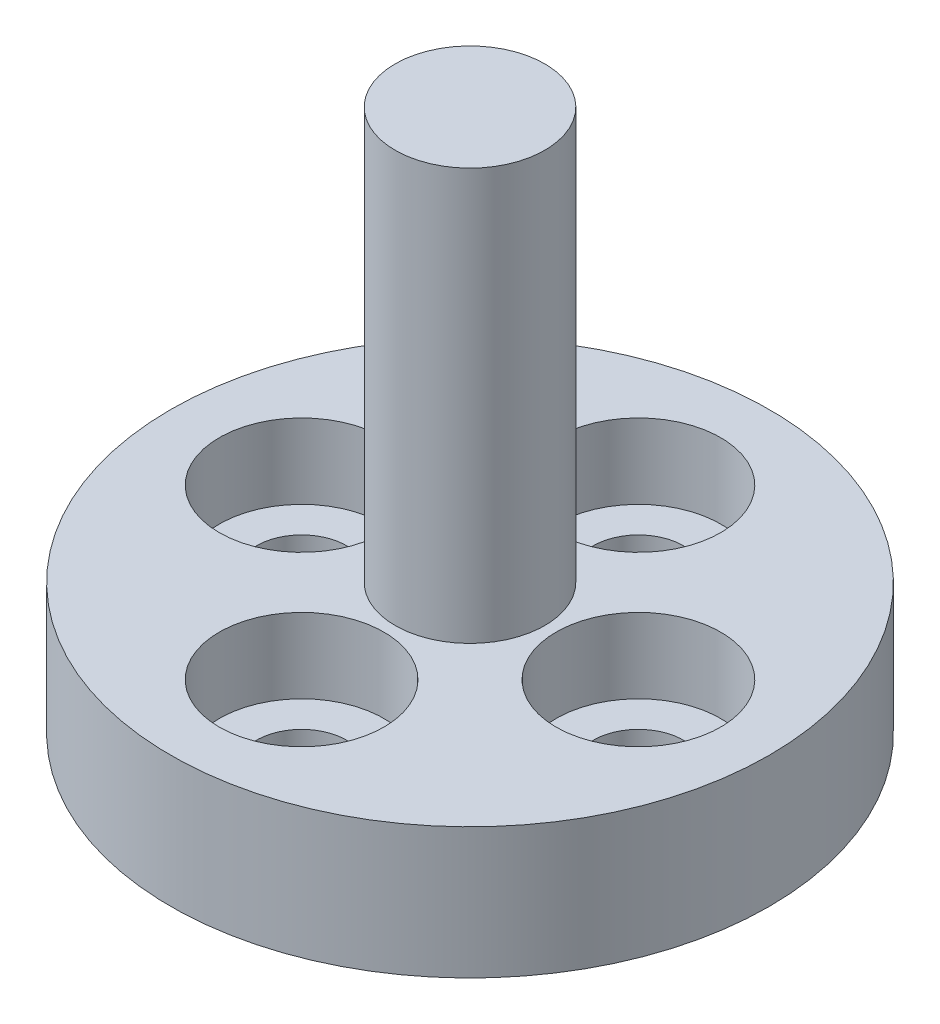
ISO-10303-21;
HEADER;
FILE_DESCRIPTION(('STEP AP214'),'2;1');
FILE_NAME('part.step','',(''),(''),'','','');
FILE_SCHEMA(('AUTOMOTIVE_DESIGN { 1 0 10303 214 1 1 1 1 }'));
ENDSEC;
DATA;
#1=APPLICATION_CONTEXT('core data for automotive mechanical design processes');
#2=APPLICATION_PROTOCOL_DEFINITION('international standard','automotive_design',2000,#1);
#3=PRODUCT_CONTEXT('',#1,'mechanical');
#4=PRODUCT('Part','Part','',(#3));
#5=PRODUCT_RELATED_PRODUCT_CATEGORY('part','',(#4));
#6=PRODUCT_DEFINITION_FORMATION('','',#4);
#7=PRODUCT_DEFINITION_CONTEXT('part definition',#1,'design');
#8=PRODUCT_DEFINITION('design','',#6,#7);
#9=PRODUCT_DEFINITION_SHAPE('','',#8);
#10=(LENGTH_UNIT() NAMED_UNIT(*) SI_UNIT(.MILLI.,.METRE.));
#11=(NAMED_UNIT(*) PLANE_ANGLE_UNIT() SI_UNIT($,.RADIAN.));
#12=(NAMED_UNIT(*) SI_UNIT($,.STERADIAN.) SOLID_ANGLE_UNIT());
#13=UNCERTAINTY_MEASURE_WITH_UNIT(LENGTH_MEASURE(1.E-05),#10,'distance_accuracy_value','');
#14=(GEOMETRIC_REPRESENTATION_CONTEXT(3) GLOBAL_UNCERTAINTY_ASSIGNED_CONTEXT((#13)) GLOBAL_UNIT_ASSIGNED_CONTEXT((#10,
#11,#12)) REPRESENTATION_CONTEXT('',''));
#15=CARTESIAN_POINT('',(0.,0.,0.));
#16=DIRECTION('',(0.,0.,1.));
#17=DIRECTION('',(1.,0.,0.));
#18=AXIS2_PLACEMENT_3D('',#15,#16,#17);
#19=CARTESIAN_POINT('',(0.,0.,0.));
#20=DIRECTION('',(0.,1.,0.));
#21=DIRECTION('',(-1.,0.,0.));
#22=AXIS2_PLACEMENT_3D('',#19,#20,#21);
#23=PLANE('',#22);
#24=CARTESIAN_POINT('',(-4.5,0.,0.));
#25=DIRECTION('',(0.,1.,0.));
#26=DIRECTION('',(0.,0.,1.));
#27=AXIS2_PLACEMENT_3D('',#24,#25,#26);
#28=CIRCLE('',#27,1.2);
#29=CARTESIAN_POINT('',(-4.5,0.,1.2));
#30=VERTEX_POINT('',#29);
#31=EDGE_CURVE('E91',#30,#30,#28,.T.);
#32=ORIENTED_EDGE('',*,*,#31,.T.);
#33=EDGE_LOOP('',(#32));
#34=FACE_BOUND('',#33,.T.);
#35=CARTESIAN_POINT('',(0.,0.,-4.5));
#36=DIRECTION('',(0.,1.,0.));
#37=DIRECTION('',(0.,0.,1.));
#38=AXIS2_PLACEMENT_3D('',#35,#36,#37);
#39=CIRCLE('',#38,1.2);
#40=CARTESIAN_POINT('',(0.,0.,-3.3));
#41=VERTEX_POINT('',#40);
#42=EDGE_CURVE('E79',#41,#41,#39,.T.);
#43=ORIENTED_EDGE('',*,*,#42,.T.);
#44=EDGE_LOOP('',(#43));
#45=FACE_BOUND('',#44,.T.);
#46=CARTESIAN_POINT('',(4.5,0.,0.));
#47=DIRECTION('',(0.,1.,0.));
#48=DIRECTION('',(0.,0.,1.));
#49=AXIS2_PLACEMENT_3D('',#46,#47,#48);
#50=CIRCLE('',#49,1.2);
#51=CARTESIAN_POINT('',(4.5,0.,1.2));
#52=VERTEX_POINT('',#51);
#53=EDGE_CURVE('E67',#52,#52,#50,.T.);
#54=ORIENTED_EDGE('',*,*,#53,.T.);
#55=EDGE_LOOP('',(#54));
#56=FACE_BOUND('',#55,.T.);
#57=CARTESIAN_POINT('',(0.,0.,4.5));
#58=DIRECTION('',(0.,1.,0.));
#59=DIRECTION('',(0.,0.,1.));
#60=AXIS2_PLACEMENT_3D('',#57,#58,#59);
#61=CIRCLE('',#60,1.2);
#62=CARTESIAN_POINT('',(0.,0.,5.7));
#63=VERTEX_POINT('',#62);
#64=EDGE_CURVE('E55',#63,#63,#61,.T.);
#65=ORIENTED_EDGE('',*,*,#64,.T.);
#66=EDGE_LOOP('',(#65));
#67=FACE_BOUND('',#66,.T.);
#68=CARTESIAN_POINT('',(0.,0.,0.));
#69=DIRECTION('',(0.,1.,0.));
#70=DIRECTION('',(-1.,0.,0.));
#71=AXIS2_PLACEMENT_3D('',#68,#69,#70);
#72=CIRCLE('',#71,8.);
#73=CARTESIAN_POINT('',(-8.,0.,0.));
#74=VERTEX_POINT('',#73);
#75=EDGE_CURVE('E10',#74,#74,#72,.T.);
#76=ORIENTED_EDGE('',*,*,#75,.F.);
#77=EDGE_LOOP('',(#76));
#78=FACE_BOUND('',#77,.T.);
#79=ADVANCED_FACE('F36',(#34,#45,#56,#67,#78),#23,.F.);
#80=CARTESIAN_POINT('',(0.,14.5,0.));
#81=DIRECTION('',(0.,1.,0.));
#82=DIRECTION('',(-1.,0.,0.));
#83=AXIS2_PLACEMENT_3D('',#80,#81,#82);
#84=CYLINDRICAL_SURFACE('',#83,8.);
#85=CARTESIAN_POINT('',(0.,3.5,0.));
#86=DIRECTION('',(0.,1.,0.));
#87=DIRECTION('',(-1.,0.,0.));
#88=AXIS2_PLACEMENT_3D('',#85,#86,#87);
#89=CIRCLE('',#88,8.);
#90=CARTESIAN_POINT('',(-8.,3.5,0.));
#91=VERTEX_POINT('',#90);
#92=EDGE_CURVE('E42',#91,#91,#89,.T.);
#93=ORIENTED_EDGE('',*,*,#92,.F.);
#94=EDGE_LOOP('',(#93));
#95=FACE_BOUND('',#94,.T.);
#96=ORIENTED_EDGE('',*,*,#75,.T.);
#97=EDGE_LOOP('',(#96));
#98=FACE_BOUND('',#97,.T.);
#99=ADVANCED_FACE('F110',(#95,#98),#84,.T.);
#100=CARTESIAN_POINT('',(8.,3.5,0.));
#101=DIRECTION('',(0.,-1.,0.));
#102=DIRECTION('',(1.,0.,0.));
#103=AXIS2_PLACEMENT_3D('',#100,#101,#102);
#104=PLANE('',#103);
#105=CARTESIAN_POINT('',(-4.5,3.5,0.));
#106=DIRECTION('',(0.,1.,0.));
#107=DIRECTION('',(0.,0.,1.));
#108=AXIS2_PLACEMENT_3D('',#105,#106,#107);
#109=CIRCLE('',#108,2.2);
#110=CARTESIAN_POINT('',(-4.5,3.5,2.2));
#111=VERTEX_POINT('',#110);
#112=EDGE_CURVE('E100',#111,#111,#109,.T.);
#113=ORIENTED_EDGE('',*,*,#112,.F.);
#114=EDGE_LOOP('',(#113));
#115=FACE_BOUND('',#114,.T.);
#116=CARTESIAN_POINT('',(0.,3.5,-4.5));
#117=DIRECTION('',(0.,1.,0.));
#118=DIRECTION('',(0.,0.,1.));
#119=AXIS2_PLACEMENT_3D('',#116,#117,#118);
#120=CIRCLE('',#119,2.2);
#121=CARTESIAN_POINT('',(0.,3.5,-2.3));
#122=VERTEX_POINT('',#121);
#123=EDGE_CURVE('E88',#122,#122,#120,.T.);
#124=ORIENTED_EDGE('',*,*,#123,.F.);
#125=EDGE_LOOP('',(#124));
#126=FACE_BOUND('',#125,.T.);
#127=CARTESIAN_POINT('',(4.5,3.5,0.));
#128=DIRECTION('',(0.,1.,0.));
#129=DIRECTION('',(0.,0.,1.));
#130=AXIS2_PLACEMENT_3D('',#127,#128,#129);
#131=CIRCLE('',#130,2.2);
#132=CARTESIAN_POINT('',(4.5,3.5,2.2));
#133=VERTEX_POINT('',#132);
#134=EDGE_CURVE('E76',#133,#133,#131,.T.);
#135=ORIENTED_EDGE('',*,*,#134,.F.);
#136=EDGE_LOOP('',(#135));
#137=FACE_BOUND('',#136,.T.);
#138=CARTESIAN_POINT('',(0.,3.5,4.5));
#139=DIRECTION('',(0.,1.,0.));
#140=DIRECTION('',(0.,0.,1.));
#141=AXIS2_PLACEMENT_3D('',#138,#139,#140);
#142=CIRCLE('',#141,2.2);
#143=CARTESIAN_POINT('',(0.,3.5,6.7));
#144=VERTEX_POINT('',#143);
#145=EDGE_CURVE('E64',#144,#144,#142,.T.);
#146=ORIENTED_EDGE('',*,*,#145,.F.);
#147=EDGE_LOOP('',(#146));
#148=FACE_BOUND('',#147,.T.);
#149=CARTESIAN_POINT('',(0.,3.5,0.));
#150=DIRECTION('',(0.,1.,0.));
#151=DIRECTION('',(-1.,0.,0.));
#152=AXIS2_PLACEMENT_3D('',#149,#150,#151);
#153=CIRCLE('',#152,2.);
#154=CARTESIAN_POINT('',(-2.,3.5,0.));
#155=VERTEX_POINT('',#154);
#156=EDGE_CURVE('E46',#155,#155,#153,.T.);
#157=ORIENTED_EDGE('',*,*,#156,.F.);
#158=EDGE_LOOP('',(#157));
#159=FACE_BOUND('',#158,.T.);
#160=ORIENTED_EDGE('',*,*,#92,.T.);
#161=EDGE_LOOP('',(#160));
#162=FACE_BOUND('',#161,.T.);
#163=ADVANCED_FACE('F106',(#115,#126,#137,#148,#159,#162),#104,.F.);
#164=CARTESIAN_POINT('',(0.,14.5,0.));
#165=DIRECTION('',(0.,1.,0.));
#166=DIRECTION('',(-1.,0.,0.));
#167=AXIS2_PLACEMENT_3D('',#164,#165,#166);
#168=CYLINDRICAL_SURFACE('',#167,2.);
#169=CARTESIAN_POINT('',(0.,14.5,0.));
#170=DIRECTION('',(0.,1.,0.));
#171=DIRECTION('',(-1.,0.,0.));
#172=AXIS2_PLACEMENT_3D('',#169,#170,#171);
#173=CIRCLE('',#172,2.);
#174=CARTESIAN_POINT('',(-2.,14.5,0.));
#175=VERTEX_POINT('',#174);
#176=EDGE_CURVE('E50',#175,#175,#173,.T.);
#177=ORIENTED_EDGE('',*,*,#176,.F.);
#178=EDGE_LOOP('',(#177));
#179=FACE_BOUND('',#178,.T.);
#180=ORIENTED_EDGE('',*,*,#156,.T.);
#181=EDGE_LOOP('',(#180));
#182=FACE_BOUND('',#181,.T.);
#183=ADVANCED_FACE('F109',(#179,#182),#168,.T.);
#184=CARTESIAN_POINT('',(2.,14.5,0.));
#185=DIRECTION('',(0.,-1.,0.));
#186=DIRECTION('',(1.,0.,0.));
#187=AXIS2_PLACEMENT_3D('',#184,#185,#186);
#188=PLANE('',#187);
#189=ORIENTED_EDGE('',*,*,#176,.T.);
#190=EDGE_LOOP('',(#189));
#191=FACE_BOUND('',#190,.T.);
#192=ADVANCED_FACE('F121',(#191),#188,.F.);
#193=CARTESIAN_POINT('',(0.,3.5,4.5));
#194=DIRECTION('',(0.,1.,0.));
#195=DIRECTION('',(0.,0.,1.));
#196=AXIS2_PLACEMENT_3D('',#193,#194,#195);
#197=CYLINDRICAL_SURFACE('',#196,1.2);
#198=ORIENTED_EDGE('',*,*,#64,.F.);
#199=EDGE_LOOP('',(#198));
#200=FACE_BOUND('',#199,.T.);
#201=CARTESIAN_POINT('',(0.,1.5,4.5));
#202=DIRECTION('',(0.,1.,0.));
#203=DIRECTION('',(0.,0.,1.));
#204=AXIS2_PLACEMENT_3D('',#201,#202,#203);
#205=CIRCLE('',#204,1.2);
#206=CARTESIAN_POINT('',(0.,1.5,5.7));
#207=VERTEX_POINT('',#206);
#208=EDGE_CURVE('E58',#207,#207,#205,.T.);
#209=ORIENTED_EDGE('',*,*,#208,.T.);
#210=EDGE_LOOP('',(#209));
#211=FACE_BOUND('',#210,.T.);
#212=ADVANCED_FACE('F127',(#200,#211),#197,.F.);
#213=CARTESIAN_POINT('',(1.2,1.5,4.5));
#214=DIRECTION('',(0.,-1.,0.));
#215=DIRECTION('',(0.,0.,-1.));
#216=AXIS2_PLACEMENT_3D('',#213,#214,#215);
#217=PLANE('',#216);
#218=ORIENTED_EDGE('',*,*,#208,.F.);
#219=EDGE_LOOP('',(#218));
#220=FACE_BOUND('',#219,.T.);
#221=CARTESIAN_POINT('',(0.,1.5,4.5));
#222=DIRECTION('',(0.,1.,0.));
#223=DIRECTION('',(0.,0.,1.));
#224=AXIS2_PLACEMENT_3D('',#221,#222,#223);
#225=CIRCLE('',#224,2.2);
#226=CARTESIAN_POINT('',(0.,1.5,6.7));
#227=VERTEX_POINT('',#226);
#228=EDGE_CURVE('E61',#227,#227,#225,.T.);
#229=ORIENTED_EDGE('',*,*,#228,.T.);
#230=EDGE_LOOP('',(#229));
#231=FACE_BOUND('',#230,.T.);
#232=ADVANCED_FACE('F148',(#220,#231),#217,.F.);
#233=CARTESIAN_POINT('',(0.,3.5,4.5));
#234=DIRECTION('',(0.,1.,0.));
#235=DIRECTION('',(0.,0.,1.));
#236=AXIS2_PLACEMENT_3D('',#233,#234,#235);
#237=CYLINDRICAL_SURFACE('',#236,2.2);
#238=ORIENTED_EDGE('',*,*,#228,.F.);
#239=EDGE_LOOP('',(#238));
#240=FACE_BOUND('',#239,.T.);
#241=ORIENTED_EDGE('',*,*,#145,.T.);
#242=EDGE_LOOP('',(#241));
#243=FACE_BOUND('',#242,.T.);
#244=ADVANCED_FACE('F154',(#240,#243),#237,.F.);
#245=CARTESIAN_POINT('',(4.5,3.5,0.));
#246=DIRECTION('',(0.,1.,0.));
#247=DIRECTION('',(0.,0.,1.));
#248=AXIS2_PLACEMENT_3D('',#245,#246,#247);
#249=CYLINDRICAL_SURFACE('',#248,1.2);
#250=ORIENTED_EDGE('',*,*,#53,.F.);
#251=EDGE_LOOP('',(#250));
#252=FACE_BOUND('',#251,.T.);
#253=CARTESIAN_POINT('',(4.5,1.5,0.));
#254=DIRECTION('',(0.,1.,0.));
#255=DIRECTION('',(0.,0.,1.));
#256=AXIS2_PLACEMENT_3D('',#253,#254,#255);
#257=CIRCLE('',#256,1.2);
#258=CARTESIAN_POINT('',(4.5,1.5,1.2));
#259=VERTEX_POINT('',#258);
#260=EDGE_CURVE('E70',#259,#259,#257,.T.);
#261=ORIENTED_EDGE('',*,*,#260,.T.);
#262=EDGE_LOOP('',(#261));
#263=FACE_BOUND('',#262,.T.);
#264=ADVANCED_FACE('F160',(#252,#263),#249,.F.);
#265=CARTESIAN_POINT('',(5.7,1.5,0.));
#266=DIRECTION('',(0.,-1.,0.));
#267=DIRECTION('',(0.,0.,-1.));
#268=AXIS2_PLACEMENT_3D('',#265,#266,#267);
#269=PLANE('',#268);
#270=ORIENTED_EDGE('',*,*,#260,.F.);
#271=EDGE_LOOP('',(#270));
#272=FACE_BOUND('',#271,.T.);
#273=CARTESIAN_POINT('',(4.5,1.5,0.));
#274=DIRECTION('',(0.,1.,0.));
#275=DIRECTION('',(0.,0.,1.));
#276=AXIS2_PLACEMENT_3D('',#273,#274,#275);
#277=CIRCLE('',#276,2.2);
#278=CARTESIAN_POINT('',(4.5,1.5,2.2));
#279=VERTEX_POINT('',#278);
#280=EDGE_CURVE('E73',#279,#279,#277,.T.);
#281=ORIENTED_EDGE('',*,*,#280,.T.);
#282=EDGE_LOOP('',(#281));
#283=FACE_BOUND('',#282,.T.);
#284=ADVANCED_FACE('F165',(#272,#283),#269,.F.);
#285=CARTESIAN_POINT('',(4.5,3.5,0.));
#286=DIRECTION('',(0.,1.,0.));
#287=DIRECTION('',(0.,0.,1.));
#288=AXIS2_PLACEMENT_3D('',#285,#286,#287);
#289=CYLINDRICAL_SURFACE('',#288,2.2);
#290=ORIENTED_EDGE('',*,*,#280,.F.);
#291=EDGE_LOOP('',(#290));
#292=FACE_BOUND('',#291,.T.);
#293=ORIENTED_EDGE('',*,*,#134,.T.);
#294=EDGE_LOOP('',(#293));
#295=FACE_BOUND('',#294,.T.);
#296=ADVANCED_FACE('F171',(#292,#295),#289,.F.);
#297=CARTESIAN_POINT('',(0.,3.5,-4.5));
#298=DIRECTION('',(0.,1.,0.));
#299=DIRECTION('',(0.,0.,1.));
#300=AXIS2_PLACEMENT_3D('',#297,#298,#299);
#301=CYLINDRICAL_SURFACE('',#300,1.2);
#302=ORIENTED_EDGE('',*,*,#42,.F.);
#303=EDGE_LOOP('',(#302));
#304=FACE_BOUND('',#303,.T.);
#305=CARTESIAN_POINT('',(0.,1.5,-4.5));
#306=DIRECTION('',(0.,1.,0.));
#307=DIRECTION('',(0.,0.,1.));
#308=AXIS2_PLACEMENT_3D('',#305,#306,#307);
#309=CIRCLE('',#308,1.2);
#310=CARTESIAN_POINT('',(0.,1.5,-3.3));
#311=VERTEX_POINT('',#310);
#312=EDGE_CURVE('E82',#311,#311,#309,.T.);
#313=ORIENTED_EDGE('',*,*,#312,.T.);
#314=EDGE_LOOP('',(#313));
#315=FACE_BOUND('',#314,.T.);
#316=ADVANCED_FACE('F175',(#304,#315),#301,.F.);
#317=CARTESIAN_POINT('',(1.2,1.5,-4.5));
#318=DIRECTION('',(0.,-1.,0.));
#319=DIRECTION('',(0.,0.,-1.));
#320=AXIS2_PLACEMENT_3D('',#317,#318,#319);
#321=PLANE('',#320);
#322=ORIENTED_EDGE('',*,*,#312,.F.);
#323=EDGE_LOOP('',(#322));
#324=FACE_BOUND('',#323,.T.);
#325=CARTESIAN_POINT('',(0.,1.5,-4.5));
#326=DIRECTION('',(0.,1.,0.));
#327=DIRECTION('',(0.,0.,1.));
#328=AXIS2_PLACEMENT_3D('',#325,#326,#327);
#329=CIRCLE('',#328,2.2);
#330=CARTESIAN_POINT('',(0.,1.5,-2.3));
#331=VERTEX_POINT('',#330);
#332=EDGE_CURVE('E85',#331,#331,#329,.T.);
#333=ORIENTED_EDGE('',*,*,#332,.T.);
#334=EDGE_LOOP('',(#333));
#335=FACE_BOUND('',#334,.T.);
#336=ADVANCED_FACE('F179',(#324,#335),#321,.F.);
#337=CARTESIAN_POINT('',(0.,3.5,-4.5));
#338=DIRECTION('',(0.,1.,0.));
#339=DIRECTION('',(0.,0.,1.));
#340=AXIS2_PLACEMENT_3D('',#337,#338,#339);
#341=CYLINDRICAL_SURFACE('',#340,2.2);
#342=ORIENTED_EDGE('',*,*,#332,.F.);
#343=EDGE_LOOP('',(#342));
#344=FACE_BOUND('',#343,.T.);
#345=ORIENTED_EDGE('',*,*,#123,.T.);
#346=EDGE_LOOP('',(#345));
#347=FACE_BOUND('',#346,.T.);
#348=ADVANCED_FACE('F183',(#344,#347),#341,.F.);
#349=CARTESIAN_POINT('',(-4.5,3.5,0.));
#350=DIRECTION('',(0.,1.,0.));
#351=DIRECTION('',(0.,0.,1.));
#352=AXIS2_PLACEMENT_3D('',#349,#350,#351);
#353=CYLINDRICAL_SURFACE('',#352,1.2);
#354=ORIENTED_EDGE('',*,*,#31,.F.);
#355=EDGE_LOOP('',(#354));
#356=FACE_BOUND('',#355,.T.);
#357=CARTESIAN_POINT('',(-4.5,1.5,0.));
#358=DIRECTION('',(0.,1.,0.));
#359=DIRECTION('',(0.,0.,1.));
#360=AXIS2_PLACEMENT_3D('',#357,#358,#359);
#361=CIRCLE('',#360,1.2);
#362=CARTESIAN_POINT('',(-4.5,1.5,1.2));
#363=VERTEX_POINT('',#362);
#364=EDGE_CURVE('E94',#363,#363,#361,.T.);
#365=ORIENTED_EDGE('',*,*,#364,.T.);
#366=EDGE_LOOP('',(#365));
#367=FACE_BOUND('',#366,.T.);
#368=ADVANCED_FACE('F187',(#356,#367),#353,.F.);
#369=CARTESIAN_POINT('',(-3.3,1.5,0.));
#370=DIRECTION('',(0.,-1.,0.));
#371=DIRECTION('',(0.,0.,-1.));
#372=AXIS2_PLACEMENT_3D('',#369,#370,#371);
#373=PLANE('',#372);
#374=ORIENTED_EDGE('',*,*,#364,.F.);
#375=EDGE_LOOP('',(#374));
#376=FACE_BOUND('',#375,.T.);
#377=CARTESIAN_POINT('',(-4.5,1.5,0.));
#378=DIRECTION('',(0.,1.,0.));
#379=DIRECTION('',(0.,0.,1.));
#380=AXIS2_PLACEMENT_3D('',#377,#378,#379);
#381=CIRCLE('',#380,2.2);
#382=CARTESIAN_POINT('',(-4.5,1.5,2.2));
#383=VERTEX_POINT('',#382);
#384=EDGE_CURVE('E97',#383,#383,#381,.T.);
#385=ORIENTED_EDGE('',*,*,#384,.T.);
#386=EDGE_LOOP('',(#385));
#387=FACE_BOUND('',#386,.T.);
#388=ADVANCED_FACE('F191',(#376,#387),#373,.F.);
#389=CARTESIAN_POINT('',(-4.5,3.5,0.));
#390=DIRECTION('',(0.,1.,0.));
#391=DIRECTION('',(0.,0.,1.));
#392=AXIS2_PLACEMENT_3D('',#389,#390,#391);
#393=CYLINDRICAL_SURFACE('',#392,2.2);
#394=ORIENTED_EDGE('',*,*,#384,.F.);
#395=EDGE_LOOP('',(#394));
#396=FACE_BOUND('',#395,.T.);
#397=ORIENTED_EDGE('',*,*,#112,.T.);
#398=EDGE_LOOP('',(#397));
#399=FACE_BOUND('',#398,.T.);
#400=ADVANCED_FACE('F104',(#396,#399),#393,.F.);
#401=CLOSED_SHELL('',(#79,#99,#163,#183,#192,#212,#232,#244,#264,#284,#296,#316,#336,#348,#368,
#388,#400));
#402=MANIFOLD_SOLID_BREP('B2',#401);
#403=ADVANCED_BREP_SHAPE_REPRESENTATION('',(#18,#402),#14);
#404=SHAPE_DEFINITION_REPRESENTATION(#9,#403);
ENDSEC;
END-ISO-10303-21;
